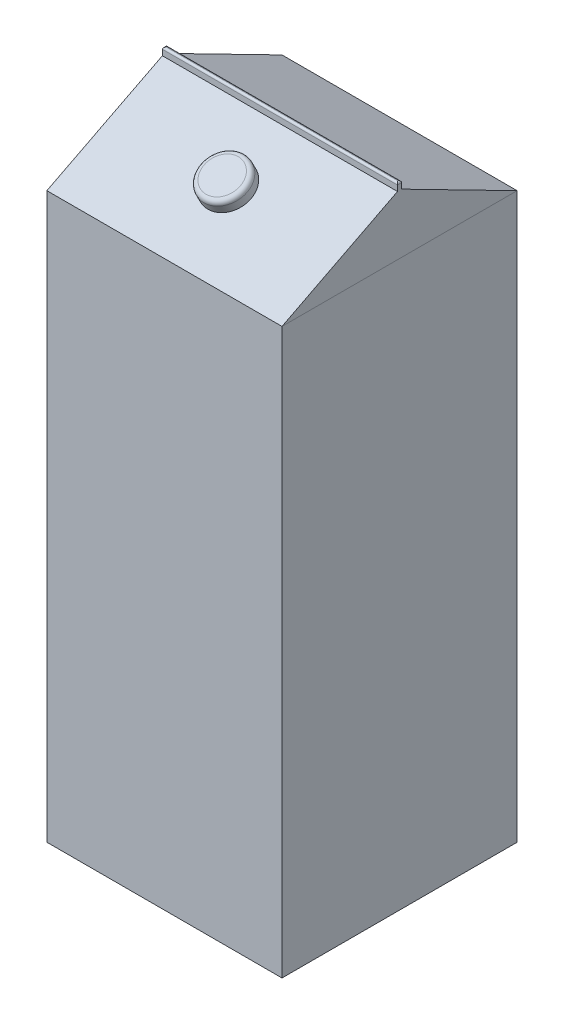
ISO-10303-21;
HEADER;
FILE_DESCRIPTION(('STEP AP214'),'2;1');
FILE_NAME('part.step','',(''),(''),'','','');
FILE_SCHEMA(('AUTOMOTIVE_DESIGN { 1 0 10303 214 1 1 1 1 }'));
ENDSEC;
DATA;
#1=APPLICATION_CONTEXT('core data for automotive mechanical design processes');
#2=APPLICATION_PROTOCOL_DEFINITION('international standard','automotive_design',2000,#1);
#3=PRODUCT_CONTEXT('',#1,'mechanical');
#4=PRODUCT('Part','Part','',(#3));
#5=PRODUCT_RELATED_PRODUCT_CATEGORY('part','',(#4));
#6=PRODUCT_DEFINITION_FORMATION('','',#4);
#7=PRODUCT_DEFINITION_CONTEXT('part definition',#1,'design');
#8=PRODUCT_DEFINITION('design','',#6,#7);
#9=PRODUCT_DEFINITION_SHAPE('','',#8);
#10=(LENGTH_UNIT() NAMED_UNIT(*) SI_UNIT(.MILLI.,.METRE.));
#11=(NAMED_UNIT(*) PLANE_ANGLE_UNIT() SI_UNIT($,.RADIAN.));
#12=(NAMED_UNIT(*) SI_UNIT($,.STERADIAN.) SOLID_ANGLE_UNIT());
#13=UNCERTAINTY_MEASURE_WITH_UNIT(LENGTH_MEASURE(1.E-05),#10,'distance_accuracy_value','');
#14=(GEOMETRIC_REPRESENTATION_CONTEXT(3) GLOBAL_UNCERTAINTY_ASSIGNED_CONTEXT((#13)) GLOBAL_UNIT_ASSIGNED_CONTEXT((#10,
#11,#12)) REPRESENTATION_CONTEXT('',''));
#15=CARTESIAN_POINT('',(0.,0.,0.));
#16=DIRECTION('',(0.,0.,1.));
#17=DIRECTION('',(1.,0.,0.));
#18=AXIS2_PLACEMENT_3D('',#15,#16,#17);
#19=CARTESIAN_POINT('',(63.5,120.795462819228,61.787415352472));
#20=DIRECTION('',(0.,-0.89029273113274,-0.45538868331592));
#21=DIRECTION('',(0.,0.45538868331592,-0.89029273113274));
#22=AXIS2_PLACEMENT_3D('',#19,#20,#21);
#23=PLANE('',#22);
#24=CARTESIAN_POINT('',(31.9758453761061,161.09049471081,-16.9900670667607));
#25=DIRECTION('',(0.,-0.89029273113274,-0.45538868331592));
#26=DIRECTION('',(0.,0.45538868331592,-0.89029273113274));
#27=AXIS2_PLACEMENT_3D('',#24,#25,#26);
#28=CIRCLE('',#27,6.1648093234389);
#29=CARTESIAN_POINT('',(31.9758453761061,163.897879111504,-22.4785519962377));
#30=VERTEX_POINT('',#29);
#31=EDGE_CURVE('E168',#30,#30,#28,.F.);
#32=ORIENTED_EDGE('',*,*,#31,.F.);
#33=EDGE_LOOP('',(#32));
#34=FACE_BOUND('',#33,.T.);
#35=DIRECTION('',(0.,-0.45538868331592,0.89029273113274));
#36=VECTOR('',#35,1.);
#37=CARTESIAN_POINT('',(0.,120.795462819228,61.787415352472));
#38=LINE('',#37,#36);
#39=CARTESIAN_POINT('',(0.,168.356274992432,-31.194792848776));
#40=VERTEX_POINT('',#39);
#41=CARTESIAN_POINT('',(0.,152.4,0.));
#42=VERTEX_POINT('',#41);
#43=EDGE_CURVE('E138',#40,#42,#38,.T.);
#44=ORIENTED_EDGE('',*,*,#43,.T.);
#45=DIRECTION('',(-1.,0.,0.));
#46=VECTOR('',#45,1.);
#47=CARTESIAN_POINT('',(63.5,152.4,0.));
#48=LINE('',#47,#46);
#49=CARTESIAN_POINT('',(63.5,152.4,0.));
#50=VERTEX_POINT('',#49);
#51=EDGE_CURVE('E128',#50,#42,#48,.T.);
#52=ORIENTED_EDGE('',*,*,#51,.F.);
#53=DIRECTION('',(0.,-0.45538868331592,0.89029273113274));
#54=VECTOR('',#53,1.);
#55=CARTESIAN_POINT('',(63.5,120.795462819228,61.787415352472));
#56=LINE('',#55,#54);
#57=CARTESIAN_POINT('',(63.5,168.356274992432,-31.194792848776));
#58=VERTEX_POINT('',#57);
#59=EDGE_CURVE('E113',#58,#50,#56,.T.);
#60=ORIENTED_EDGE('',*,*,#59,.F.);
#61=DIRECTION('',(-1.,0.,0.));
#62=VECTOR('',#61,1.);
#63=CARTESIAN_POINT('',(63.5,168.356274992432,-31.194792848776));
#64=LINE('',#63,#62);
#65=EDGE_CURVE('E118',#58,#40,#64,.T.);
#66=ORIENTED_EDGE('',*,*,#65,.T.);
#67=EDGE_LOOP('',(#44,#52,#60,#66));
#68=FACE_BOUND('',#67,.T.);
#69=ADVANCED_FACE('F45',(#34,#68),#23,.F.);
#70=CARTESIAN_POINT('',(63.5,152.4,0.));
#71=DIRECTION('',(0.,1.,0.));
#72=DIRECTION('',(0.,0.,1.));
#73=AXIS2_PLACEMENT_3D('',#70,#71,#72);
#74=PLANE('',#73);
#75=DIRECTION('',(0.,0.,-1.));
#76=VECTOR('',#75,1.);
#77=CARTESIAN_POINT('',(0.,152.4,0.));
#78=LINE('',#77,#76);
#79=CARTESIAN_POINT('',(0.,152.4,-63.5));
#80=VERTEX_POINT('',#79);
#81=EDGE_CURVE('E129',#42,#80,#78,.T.);
#82=ORIENTED_EDGE('',*,*,#81,.T.);
#83=DIRECTION('',(-1.,0.,0.));
#84=VECTOR('',#83,1.);
#85=CARTESIAN_POINT('',(63.5,152.4,-63.5));
#86=LINE('',#85,#84);
#87=CARTESIAN_POINT('',(63.5,152.4,-63.5));
#88=VERTEX_POINT('',#87);
#89=EDGE_CURVE('E148',#88,#80,#86,.T.);
#90=ORIENTED_EDGE('',*,*,#89,.F.);
#91=DIRECTION('',(0.,0.,-1.));
#92=VECTOR('',#91,1.);
#93=CARTESIAN_POINT('',(63.5,152.4,0.));
#94=LINE('',#93,#92);
#95=EDGE_CURVE('E125',#50,#88,#94,.T.);
#96=ORIENTED_EDGE('',*,*,#95,.F.);
#97=ORIENTED_EDGE('',*,*,#51,.T.);
#98=EDGE_LOOP('',(#82,#90,#96,#97));
#99=FACE_BOUND('',#98,.T.);
#100=ADVANCED_FACE('F193',(#99),#74,.F.);
#101=CARTESIAN_POINT('',(63.5,146.540219216091,-74.9559725111272));
#102=DIRECTION('',(0.,-0.89029273113274,0.45538868331592));
#103=DIRECTION('',(0.,-0.45538868331592,-0.89029273113274));
#104=AXIS2_PLACEMENT_3D('',#101,#102,#103);
#105=PLANE('',#104);
#106=DIRECTION('',(0.,0.45538868331592,0.89029273113274));
#107=VECTOR('',#106,1.);
#108=CARTESIAN_POINT('',(0.,146.540219216091,-74.9559725111272));
#109=LINE('',#108,#107);
#110=CARTESIAN_POINT('',(0.,168.355749252224,-32.3062349823984));
#111=VERTEX_POINT('',#110);
#112=EDGE_CURVE('E131',#80,#111,#109,.T.);
#113=ORIENTED_EDGE('',*,*,#112,.T.);
#114=DIRECTION('',(-1.,0.,0.));
#115=VECTOR('',#114,1.);
#116=CARTESIAN_POINT('',(63.5,168.355749252224,-32.3062349823984));
#117=LINE('',#116,#115);
#118=CARTESIAN_POINT('',(63.5,168.355749252224,-32.3062349823984));
#119=VERTEX_POINT('',#118);
#120=EDGE_CURVE('E124',#119,#111,#117,.T.);
#121=ORIENTED_EDGE('',*,*,#120,.F.);
#122=DIRECTION('',(0.,0.45538868331592,0.89029273113274));
#123=VECTOR('',#122,1.);
#124=CARTESIAN_POINT('',(63.5,146.540219216091,-74.9559725111272));
#125=LINE('',#124,#123);
#126=EDGE_CURVE('E135',#88,#119,#125,.T.);
#127=ORIENTED_EDGE('',*,*,#126,.F.);
#128=ORIENTED_EDGE('',*,*,#89,.T.);
#129=EDGE_LOOP('',(#113,#121,#127,#128));
#130=FACE_BOUND('',#129,.T.);
#131=ADVANCED_FACE('F201',(#130),#105,.F.);
#132=CARTESIAN_POINT('',(63.5,0.,-32.3062349823984));
#133=DIRECTION('',(0.,0.,1.));
#134=DIRECTION('',(1.,0.,0.));
#135=AXIS2_PLACEMENT_3D('',#132,#133,#134);
#136=PLANE('',#135);
#137=DIRECTION('',(0.,1.,0.));
#138=VECTOR('',#137,1.);
#139=CARTESIAN_POINT('',(0.,0.,-32.3062349823984));
#140=LINE('',#139,#138);
#141=CARTESIAN_POINT('',(0.,169.872405738286,-32.3062349823984));
#142=VERTEX_POINT('',#141);
#143=EDGE_CURVE('E142',#111,#142,#140,.T.);
#144=ORIENTED_EDGE('',*,*,#143,.T.);
#145=DIRECTION('',(-1.,0.,0.));
#146=VECTOR('',#145,1.);
#147=CARTESIAN_POINT('',(63.5,169.872405738286,-32.3062349823984));
#148=LINE('',#147,#146);
#149=CARTESIAN_POINT('',(63.5,169.872405738286,-32.3062349823984));
#150=VERTEX_POINT('',#149);
#151=EDGE_CURVE('E161',#142,#150,#148,.F.);
#152=ORIENTED_EDGE('',*,*,#151,.T.);
#153=DIRECTION('',(0.,1.,0.));
#154=VECTOR('',#153,1.);
#155=CARTESIAN_POINT('',(63.5,0.,-32.3062349823984));
#156=LINE('',#155,#154);
#157=EDGE_CURVE('E115',#119,#150,#156,.T.);
#158=ORIENTED_EDGE('',*,*,#157,.F.);
#159=ORIENTED_EDGE('',*,*,#120,.T.);
#160=EDGE_LOOP('',(#144,#152,#158,#159));
#161=FACE_BOUND('',#160,.T.);
#162=ADVANCED_FACE('F239',(#161),#136,.F.);
#163=CARTESIAN_POINT('',(63.5,170.380405738286,0.));
#164=DIRECTION('',(0.,-1.,0.));
#165=DIRECTION('',(0.,0.,-1.));
#166=AXIS2_PLACEMENT_3D('',#163,#164,#165);
#167=PLANE('',#166);
#168=DIRECTION('',(0.,0.,1.));
#169=VECTOR('',#168,1.);
#170=CARTESIAN_POINT('',(62.992,170.380405738286,0.));
#171=LINE('',#170,#169);
#172=CARTESIAN_POINT('',(62.992,170.380405738286,-31.702792848776));
#173=VERTEX_POINT('',#172);
#174=CARTESIAN_POINT('',(62.992,170.380405738286,-31.7982349823984));
#175=VERTEX_POINT('',#174);
#176=EDGE_CURVE('E156',#173,#175,#171,.F.);
#177=ORIENTED_EDGE('',*,*,#176,.T.);
#178=DIRECTION('',(-1.,0.,0.));
#179=VECTOR('',#178,1.);
#180=CARTESIAN_POINT('',(63.5,170.380405738286,-31.7982349823984));
#181=LINE('',#180,#179);
#182=CARTESIAN_POINT('',(0.507999999999995,170.380405738286,-31.7982349823984));
#183=VERTEX_POINT('',#182);
#184=EDGE_CURVE('E158',#175,#183,#181,.T.);
#185=ORIENTED_EDGE('',*,*,#184,.T.);
#186=DIRECTION('',(0.,0.,1.));
#187=VECTOR('',#186,1.);
#188=CARTESIAN_POINT('',(0.507999999999995,170.380405738286,-31.194792848776));
#189=LINE('',#188,#187);
#190=CARTESIAN_POINT('',(0.507999999999995,170.380405738286,-31.702792848776));
#191=VERTEX_POINT('',#190);
#192=EDGE_CURVE('E147',#183,#191,#189,.T.);
#193=ORIENTED_EDGE('',*,*,#192,.T.);
#194=DIRECTION('',(-1.,0.,0.));
#195=VECTOR('',#194,1.);
#196=CARTESIAN_POINT('',(63.5,170.380405738286,-31.702792848776));
#197=LINE('',#196,#195);
#198=EDGE_CURVE('E154',#191,#173,#197,.F.);
#199=ORIENTED_EDGE('',*,*,#198,.T.);
#200=EDGE_LOOP('',(#177,#185,#193,#199));
#201=FACE_BOUND('',#200,.T.);
#202=ADVANCED_FACE('F246',(#201),#167,.F.);
#203=CARTESIAN_POINT('',(63.5,0.,-31.194792848776));
#204=DIRECTION('',(0.,0.,-1.));
#205=DIRECTION('',(-1.,0.,0.));
#206=AXIS2_PLACEMENT_3D('',#203,#204,#205);
#207=PLANE('',#206);
#208=DIRECTION('',(0.,-1.,0.));
#209=VECTOR('',#208,1.);
#210=CARTESIAN_POINT('',(63.5,0.,-31.194792848776));
#211=LINE('',#210,#209);
#212=CARTESIAN_POINT('',(63.5,169.872405738286,-31.194792848776));
#213=VERTEX_POINT('',#212);
#214=EDGE_CURVE('E109',#213,#58,#211,.T.);
#215=ORIENTED_EDGE('',*,*,#214,.F.);
#216=DIRECTION('',(-1.,0.,0.));
#217=VECTOR('',#216,1.);
#218=CARTESIAN_POINT('',(63.5,169.872405738286,-31.194792848776));
#219=LINE('',#218,#217);
#220=CARTESIAN_POINT('',(0.,169.872405738286,-31.194792848776));
#221=VERTEX_POINT('',#220);
#222=EDGE_CURVE('E60',#213,#221,#219,.T.);
#223=ORIENTED_EDGE('',*,*,#222,.T.);
#224=DIRECTION('',(0.,-1.,0.));
#225=VECTOR('',#224,1.);
#226=CARTESIAN_POINT('',(0.,0.,-31.194792848776));
#227=LINE('',#226,#225);
#228=EDGE_CURVE('E120',#221,#40,#227,.T.);
#229=ORIENTED_EDGE('',*,*,#228,.T.);
#230=ORIENTED_EDGE('',*,*,#65,.F.);
#231=EDGE_LOOP('',(#215,#223,#229,#230));
#232=FACE_BOUND('',#231,.T.);
#233=ADVANCED_FACE('F119',(#232),#207,.F.);
#234=CARTESIAN_POINT('',(63.5,0.,0.));
#235=DIRECTION('',(-1.,0.,0.));
#236=DIRECTION('',(0.,0.,1.));
#237=AXIS2_PLACEMENT_3D('',#234,#235,#236);
#238=PLANE('',#237);
#239=ORIENTED_EDGE('',*,*,#157,.T.);
#240=DIRECTION('',(0.,0.,1.));
#241=VECTOR('',#240,1.);
#242=CARTESIAN_POINT('',(63.5,169.872405738286,0.));
#243=LINE('',#242,#241);
#244=EDGE_CURVE('E68',#150,#213,#243,.T.);
#245=ORIENTED_EDGE('',*,*,#244,.T.);
#246=ORIENTED_EDGE('',*,*,#214,.T.);
#247=ORIENTED_EDGE('',*,*,#59,.T.);
#248=ORIENTED_EDGE('',*,*,#95,.T.);
#249=ORIENTED_EDGE('',*,*,#126,.T.);
#250=EDGE_LOOP('',(#239,#245,#246,#247,#248,#249));
#251=FACE_BOUND('',#250,.T.);
#252=ADVANCED_FACE('F111',(#251),#238,.F.);
#253=CARTESIAN_POINT('',(0.,0.,0.));
#254=DIRECTION('',(-1.,0.,0.));
#255=DIRECTION('',(0.,0.,1.));
#256=AXIS2_PLACEMENT_3D('',#253,#254,#255);
#257=PLANE('',#256);
#258=ORIENTED_EDGE('',*,*,#228,.F.);
#259=DIRECTION('',(0.,0.,1.));
#260=VECTOR('',#259,1.);
#261=CARTESIAN_POINT('',(0.,169.872405738286,-32.3062349823984));
#262=LINE('',#261,#260);
#263=EDGE_CURVE('E166',#221,#142,#262,.F.);
#264=ORIENTED_EDGE('',*,*,#263,.T.);
#265=ORIENTED_EDGE('',*,*,#143,.F.);
#266=ORIENTED_EDGE('',*,*,#112,.F.);
#267=ORIENTED_EDGE('',*,*,#81,.F.);
#268=ORIENTED_EDGE('',*,*,#43,.F.);
#269=EDGE_LOOP('',(#258,#264,#265,#266,#267,#268));
#270=FACE_BOUND('',#269,.T.);
#271=ADVANCED_FACE('F221',(#270),#257,.T.);
#272=CARTESIAN_POINT('',(63.5,169.872405738286,-31.702792848776));
#273=DIRECTION('',(-1.,0.,0.));
#274=DIRECTION('',(0.,0.,1.));
#275=AXIS2_PLACEMENT_3D('',#272,#273,#274);
#276=CYLINDRICAL_SURFACE('',#275,0.508);
#277=CARTESIAN_POINT('',(0.507999999999995,169.872405738286,-31.702792848776));
#278=DIRECTION('',(-0.707106781186547,0.,-0.707106781186547));
#279=DIRECTION('',(0.707106781186547,0.,-0.707106781186547));
#280=AXIS2_PLACEMENT_3D('',#277,#278,#279);
#281=ELLIPSE('',#280,0.718420489685532,0.508);
#282=EDGE_CURVE('E173',#221,#191,#281,.T.);
#283=ORIENTED_EDGE('',*,*,#282,.F.);
#284=ORIENTED_EDGE('',*,*,#222,.F.);
#285=CARTESIAN_POINT('',(62.992,169.872405738286,-31.702792848776));
#286=DIRECTION('',(-0.707106781186547,0.,0.707106781186547));
#287=DIRECTION('',(-0.707106781186547,0.,-0.707106781186547));
#288=AXIS2_PLACEMENT_3D('',#285,#286,#287);
#289=ELLIPSE('',#288,0.718420489685532,0.508);
#290=EDGE_CURVE('E140',#173,#213,#289,.F.);
#291=ORIENTED_EDGE('',*,*,#290,.F.);
#292=ORIENTED_EDGE('',*,*,#198,.F.);
#293=EDGE_LOOP('',(#283,#284,#291,#292));
#294=FACE_BOUND('',#293,.T.);
#295=ADVANCED_FACE('F218',(#294),#276,.T.);
#296=CARTESIAN_POINT('',(62.992,169.872405738286,0.));
#297=DIRECTION('',(0.,0.,1.));
#298=DIRECTION('',(1.,0.,0.));
#299=AXIS2_PLACEMENT_3D('',#296,#297,#298);
#300=CYLINDRICAL_SURFACE('',#299,0.508);
#301=ORIENTED_EDGE('',*,*,#290,.T.);
#302=ORIENTED_EDGE('',*,*,#244,.F.);
#303=CARTESIAN_POINT('',(62.992,169.872405738286,-31.7982349823984));
#304=DIRECTION('',(0.707106781186547,0.,0.707106781186547));
#305=DIRECTION('',(-0.707106781186547,0.,0.707106781186547));
#306=AXIS2_PLACEMENT_3D('',#303,#304,#305);
#307=ELLIPSE('',#306,0.718420489685532,0.508);
#308=EDGE_CURVE('E171',#175,#150,#307,.F.);
#309=ORIENTED_EDGE('',*,*,#308,.F.);
#310=ORIENTED_EDGE('',*,*,#176,.F.);
#311=EDGE_LOOP('',(#301,#302,#309,#310));
#312=FACE_BOUND('',#311,.T.);
#313=ADVANCED_FACE('F215',(#312),#300,.T.);
#314=CARTESIAN_POINT('',(0.507999999999995,169.872405738286,0.));
#315=DIRECTION('',(0.,0.,-1.));
#316=DIRECTION('',(-1.,0.,0.));
#317=AXIS2_PLACEMENT_3D('',#314,#315,#316);
#318=CYLINDRICAL_SURFACE('',#317,0.508);
#319=ORIENTED_EDGE('',*,*,#282,.T.);
#320=ORIENTED_EDGE('',*,*,#192,.F.);
#321=CARTESIAN_POINT('',(0.507999999999995,169.872405738286,-31.7982349823984));
#322=DIRECTION('',(0.707106781186547,0.,-0.707106781186547));
#323=DIRECTION('',(-0.707106781186547,0.,-0.707106781186547));
#324=AXIS2_PLACEMENT_3D('',#321,#322,#323);
#325=ELLIPSE('',#324,0.718420489685532,0.508);
#326=EDGE_CURVE('E169',#142,#183,#325,.T.);
#327=ORIENTED_EDGE('',*,*,#326,.F.);
#328=ORIENTED_EDGE('',*,*,#263,.F.);
#329=EDGE_LOOP('',(#319,#320,#327,#328));
#330=FACE_BOUND('',#329,.T.);
#331=ADVANCED_FACE('F211',(#330),#318,.T.);
#332=CARTESIAN_POINT('',(63.5,169.872405738286,-31.7982349823984));
#333=DIRECTION('',(-1.,0.,0.));
#334=DIRECTION('',(0.,0.,1.));
#335=AXIS2_PLACEMENT_3D('',#332,#333,#334);
#336=CYLINDRICAL_SURFACE('',#335,0.508);
#337=ORIENTED_EDGE('',*,*,#308,.T.);
#338=ORIENTED_EDGE('',*,*,#151,.F.);
#339=ORIENTED_EDGE('',*,*,#326,.T.);
#340=ORIENTED_EDGE('',*,*,#184,.F.);
#341=EDGE_LOOP('',(#337,#338,#339,#340));
#342=FACE_BOUND('',#341,.T.);
#343=ADVANCED_FACE('F208',(#342),#336,.T.);
#344=CARTESIAN_POINT('',(31.9758453761061,164.256375662718,-15.3707049088893));
#345=DIRECTION('',(0.,-0.89029273113274,-0.45538868331592));
#346=DIRECTION('',(0.,0.45538868331592,-0.89029273113274));
#347=AXIS2_PLACEMENT_3D('',#344,#345,#346);
#348=CYLINDRICAL_SURFACE('',#347,6.1648093234389);
#349=CARTESIAN_POINT('',(31.9758453761061,163.125703894179,-15.9490485367005));
#350=DIRECTION('',(0.,0.89029273113274,0.45538868331592));
#351=DIRECTION('',(0.,-0.45538868331592,0.890292731132739));
#352=AXIS2_PLACEMENT_3D('',#349,#350,#351);
#353=CIRCLE('',#352,6.1648093234389);
#354=CARTESIAN_POINT('',(31.9758453761061,160.318319493485,-10.4605636072235));
#355=VERTEX_POINT('',#354);
#356=EDGE_CURVE('E12',#355,#355,#353,.F.);
#357=ORIENTED_EDGE('',*,*,#356,.T.);
#358=EDGE_LOOP('',(#357));
#359=FACE_BOUND('',#358,.T.);
#360=ORIENTED_EDGE('',*,*,#31,.T.);
#361=EDGE_LOOP('',(#360));
#362=FACE_BOUND('',#361,.T.);
#363=ADVANCED_FACE('F189',(#359,#362),#348,.T.);
#364=CARTESIAN_POINT('',(31.9758453761061,164.256375662718,-15.3707049088893));
#365=DIRECTION('',(0.,0.89029273113274,0.45538868331592));
#366=DIRECTION('',(0.,-0.45538868331592,0.890292731132739));
#367=AXIS2_PLACEMENT_3D('',#364,#365,#366);
#368=PLANE('',#367);
#369=CARTESIAN_POINT('',(31.9758453761061,164.256375662718,-15.3707049088893));
#370=DIRECTION('',(0.,0.89029273113274,0.45538868331592));
#371=DIRECTION('',(0.,-0.45538868331592,0.890292731132739));
#372=AXIS2_PLACEMENT_3D('',#369,#370,#371);
#373=CIRCLE('',#372,4.8948093234389);
#374=CARTESIAN_POINT('',(31.9758453761061,162.027334889834,-11.0128917479509));
#375=VERTEX_POINT('',#374);
#376=EDGE_CURVE('E53',#375,#375,#373,.T.);
#377=ORIENTED_EDGE('',*,*,#376,.T.);
#378=EDGE_LOOP('',(#377));
#379=FACE_BOUND('',#378,.T.);
#380=ADVANCED_FACE('F182',(#379),#368,.T.);
#381=CARTESIAN_POINT('',(31.9758453761061,163.125703894179,-15.9490485367005));
#382=DIRECTION('',(0.,0.89029273113274,0.45538868331592));
#383=DIRECTION('',(0.,-0.45538868331592,0.890292731132739));
#384=AXIS2_PLACEMENT_3D('',#381,#382,#383);
#385=TOROIDAL_SURFACE('',#384,4.8948093234389,1.27);
#386=ORIENTED_EDGE('',*,*,#356,.F.);
#387=EDGE_LOOP('',(#386));
#388=FACE_BOUND('',#387,.T.);
#389=ORIENTED_EDGE('',*,*,#376,.F.);
#390=EDGE_LOOP('',(#389));
#391=FACE_BOUND('',#390,.T.);
#392=ADVANCED_FACE('F47',(#388,#391),#385,.T.);
#393=CLOSED_SHELL('',(#69,#100,#131,#162,#202,#233,#252,#271,#295,#313,#331,#343,#363,#380,#392));
#394=MANIFOLD_SOLID_BREP('B2',#393);
#395=CARTESIAN_POINT('',(63.5,0.,0.));
#396=DIRECTION('',(0.,0.,-1.));
#397=DIRECTION('',(-1.,0.,0.));
#398=AXIS2_PLACEMENT_3D('',#395,#396,#397);
#399=PLANE('',#398);
#400=DIRECTION('',(0.,-1.,0.));
#401=VECTOR('',#400,1.);
#402=CARTESIAN_POINT('',(0.,0.,0.));
#403=LINE('',#402,#401);
#404=CARTESIAN_POINT('',(0.,152.4,0.));
#405=VERTEX_POINT('',#404);
#406=CARTESIAN_POINT('',(0.,0.,0.));
#407=VERTEX_POINT('',#406);
#408=EDGE_CURVE('E431',#405,#407,#403,.T.);
#409=ORIENTED_EDGE('',*,*,#408,.T.);
#410=DIRECTION('',(-1.,0.,0.));
#411=VECTOR('',#410,1.);
#412=CARTESIAN_POINT('',(63.5,0.,0.));
#413=LINE('',#412,#411);
#414=CARTESIAN_POINT('',(63.5,0.,0.));
#415=VERTEX_POINT('',#414);
#416=EDGE_CURVE('E43',#415,#407,#413,.T.);
#417=ORIENTED_EDGE('',*,*,#416,.F.);
#418=DIRECTION('',(0.,-1.,0.));
#419=VECTOR('',#418,1.);
#420=CARTESIAN_POINT('',(63.5,0.,0.));
#421=LINE('',#420,#419);
#422=CARTESIAN_POINT('',(63.5,152.4,0.));
#423=VERTEX_POINT('',#422);
#424=EDGE_CURVE('E419',#423,#415,#421,.T.);
#425=ORIENTED_EDGE('',*,*,#424,.F.);
#426=DIRECTION('',(-1.,0.,0.));
#427=VECTOR('',#426,1.);
#428=CARTESIAN_POINT('',(63.5,152.4,0.));
#429=LINE('',#428,#427);
#430=EDGE_CURVE('E427',#423,#405,#429,.T.);
#431=ORIENTED_EDGE('',*,*,#430,.T.);
#432=EDGE_LOOP('',(#409,#417,#425,#431));
#433=FACE_BOUND('',#432,.T.);
#434=ADVANCED_FACE('F368',(#433),#399,.F.);
#435=CARTESIAN_POINT('',(63.5,0.,0.));
#436=DIRECTION('',(0.,1.,0.));
#437=DIRECTION('',(0.,0.,1.));
#438=AXIS2_PLACEMENT_3D('',#435,#436,#437);
#439=PLANE('',#438);
#440=DIRECTION('',(0.,0.,-1.));
#441=VECTOR('',#440,1.);
#442=CARTESIAN_POINT('',(0.,0.,0.));
#443=LINE('',#442,#441);
#444=CARTESIAN_POINT('',(0.,0.,-63.5));
#445=VERTEX_POINT('',#444);
#446=EDGE_CURVE('E423',#407,#445,#443,.T.);
#447=ORIENTED_EDGE('',*,*,#446,.T.);
#448=DIRECTION('',(-1.,0.,0.));
#449=VECTOR('',#448,1.);
#450=CARTESIAN_POINT('',(63.5,0.,-63.5));
#451=LINE('',#450,#449);
#452=CARTESIAN_POINT('',(63.5,0.,-63.5));
#453=VERTEX_POINT('',#452);
#454=EDGE_CURVE('E376',#453,#445,#451,.T.);
#455=ORIENTED_EDGE('',*,*,#454,.F.);
#456=DIRECTION('',(0.,0.,-1.));
#457=VECTOR('',#456,1.);
#458=CARTESIAN_POINT('',(63.5,0.,0.));
#459=LINE('',#458,#457);
#460=EDGE_CURVE('E414',#415,#453,#459,.T.);
#461=ORIENTED_EDGE('',*,*,#460,.F.);
#462=ORIENTED_EDGE('',*,*,#416,.T.);
#463=EDGE_LOOP('',(#447,#455,#461,#462));
#464=FACE_BOUND('',#463,.T.);
#465=ADVANCED_FACE('F422',(#464),#439,.F.);
#466=CARTESIAN_POINT('',(63.5,0.,-63.5));
#467=DIRECTION('',(0.,0.,1.));
#468=DIRECTION('',(1.,0.,0.));
#469=AXIS2_PLACEMENT_3D('',#466,#467,#468);
#470=PLANE('',#469);
#471=DIRECTION('',(0.,1.,0.));
#472=VECTOR('',#471,1.);
#473=CARTESIAN_POINT('',(0.,0.,-63.5));
#474=LINE('',#473,#472);
#475=CARTESIAN_POINT('',(0.,152.4,-63.5));
#476=VERTEX_POINT('',#475);
#477=EDGE_CURVE('E401',#445,#476,#474,.T.);
#478=ORIENTED_EDGE('',*,*,#477,.T.);
#479=DIRECTION('',(-1.,0.,0.));
#480=VECTOR('',#479,1.);
#481=CARTESIAN_POINT('',(63.5,152.4,-63.5));
#482=LINE('',#481,#480);
#483=CARTESIAN_POINT('',(63.5,152.4,-63.5));
#484=VERTEX_POINT('',#483);
#485=EDGE_CURVE('E424',#484,#476,#482,.T.);
#486=ORIENTED_EDGE('',*,*,#485,.F.);
#487=DIRECTION('',(0.,1.,0.));
#488=VECTOR('',#487,1.);
#489=CARTESIAN_POINT('',(63.5,0.,-63.5));
#490=LINE('',#489,#488);
#491=EDGE_CURVE('E417',#453,#484,#490,.T.);
#492=ORIENTED_EDGE('',*,*,#491,.F.);
#493=ORIENTED_EDGE('',*,*,#454,.T.);
#494=EDGE_LOOP('',(#478,#486,#492,#493));
#495=FACE_BOUND('',#494,.T.);
#496=ADVANCED_FACE('F425',(#495),#470,.F.);
#497=CARTESIAN_POINT('',(63.5,152.4,0.));
#498=DIRECTION('',(0.,-1.,0.));
#499=DIRECTION('',(0.,0.,-1.));
#500=AXIS2_PLACEMENT_3D('',#497,#498,#499);
#501=PLANE('',#500);
#502=DIRECTION('',(0.,0.,1.));
#503=VECTOR('',#502,1.);
#504=CARTESIAN_POINT('',(0.,152.4,0.));
#505=LINE('',#504,#503);
#506=EDGE_CURVE('E407',#476,#405,#505,.T.);
#507=ORIENTED_EDGE('',*,*,#506,.T.);
#508=ORIENTED_EDGE('',*,*,#430,.F.);
#509=DIRECTION('',(0.,0.,1.));
#510=VECTOR('',#509,1.);
#511=CARTESIAN_POINT('',(63.5,152.4,0.));
#512=LINE('',#511,#510);
#513=EDGE_CURVE('E384',#484,#423,#512,.T.);
#514=ORIENTED_EDGE('',*,*,#513,.F.);
#515=ORIENTED_EDGE('',*,*,#485,.T.);
#516=EDGE_LOOP('',(#507,#508,#514,#515));
#517=FACE_BOUND('',#516,.T.);
#518=ADVANCED_FACE('F438',(#517),#501,.F.);
#519=CARTESIAN_POINT('',(63.5,0.,0.));
#520=DIRECTION('',(-1.,0.,0.));
#521=DIRECTION('',(0.,0.,1.));
#522=AXIS2_PLACEMENT_3D('',#519,#520,#521);
#523=PLANE('',#522);
#524=ORIENTED_EDGE('',*,*,#424,.T.);
#525=ORIENTED_EDGE('',*,*,#460,.T.);
#526=ORIENTED_EDGE('',*,*,#491,.T.);
#527=ORIENTED_EDGE('',*,*,#513,.T.);
#528=EDGE_LOOP('',(#524,#525,#526,#527));
#529=FACE_BOUND('',#528,.T.);
#530=ADVANCED_FACE('F415',(#529),#523,.F.);
#531=CARTESIAN_POINT('',(0.,0.,0.));
#532=DIRECTION('',(-1.,0.,0.));
#533=DIRECTION('',(0.,0.,1.));
#534=AXIS2_PLACEMENT_3D('',#531,#532,#533);
#535=PLANE('',#534);
#536=ORIENTED_EDGE('',*,*,#408,.F.);
#537=ORIENTED_EDGE('',*,*,#506,.F.);
#538=ORIENTED_EDGE('',*,*,#477,.F.);
#539=ORIENTED_EDGE('',*,*,#446,.F.);
#540=EDGE_LOOP('',(#536,#537,#538,#539));
#541=FACE_BOUND('',#540,.T.);
#542=ADVANCED_FACE('F441',(#541),#535,.T.);
#543=CLOSED_SHELL('',(#434,#465,#496,#518,#530,#542));
#544=MANIFOLD_SOLID_BREP('B6',#543);
#545=ADVANCED_BREP_SHAPE_REPRESENTATION('',(#18,#394,#544),#14);
#546=SHAPE_DEFINITION_REPRESENTATION(#9,#545);
ENDSEC;
END-ISO-10303-21;
